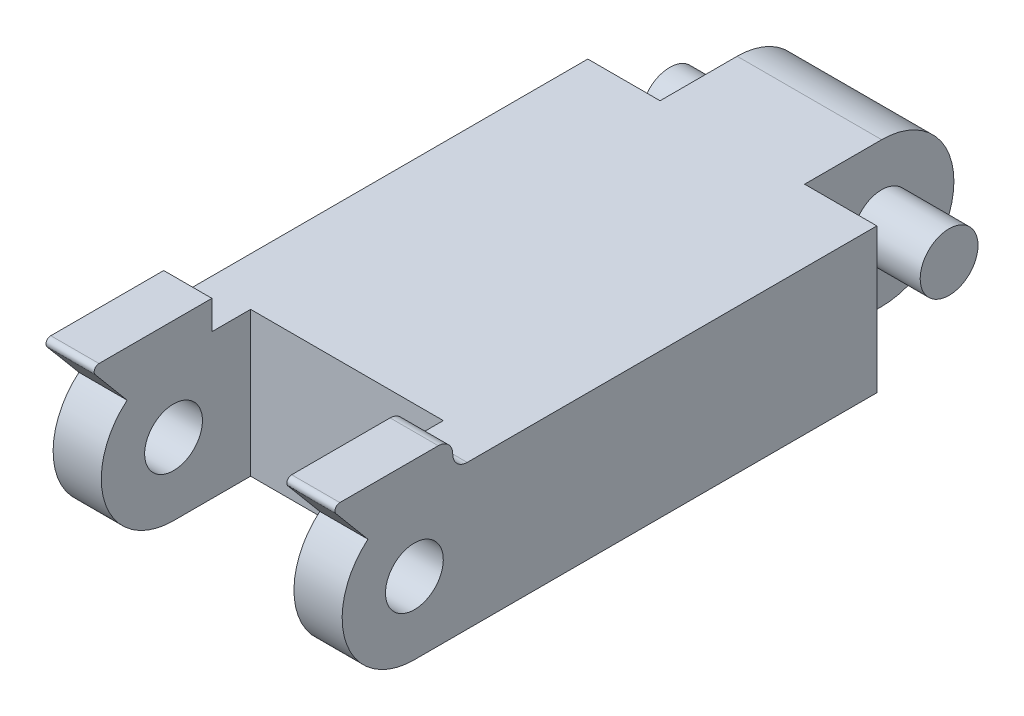
ISO-10303-21;
HEADER;
FILE_DESCRIPTION(('STEP AP214'),'2;1');
FILE_NAME('part.step','',(''),(''),'','','');
FILE_SCHEMA(('AUTOMOTIVE_DESIGN { 1 0 10303 214 1 1 1 1 }'));
ENDSEC;
DATA;
#1=APPLICATION_CONTEXT('core data for automotive mechanical design processes');
#2=APPLICATION_PROTOCOL_DEFINITION('international standard','automotive_design',2000,#1);
#3=PRODUCT_CONTEXT('',#1,'mechanical');
#4=PRODUCT('Part','Part','',(#3));
#5=PRODUCT_RELATED_PRODUCT_CATEGORY('part','',(#4));
#6=PRODUCT_DEFINITION_FORMATION('','',#4);
#7=PRODUCT_DEFINITION_CONTEXT('part definition',#1,'design');
#8=PRODUCT_DEFINITION('design','',#6,#7);
#9=PRODUCT_DEFINITION_SHAPE('','',#8);
#10=(LENGTH_UNIT() NAMED_UNIT(*) SI_UNIT(.MILLI.,.METRE.));
#11=(NAMED_UNIT(*) PLANE_ANGLE_UNIT() SI_UNIT($,.RADIAN.));
#12=(NAMED_UNIT(*) SI_UNIT($,.STERADIAN.) SOLID_ANGLE_UNIT());
#13=UNCERTAINTY_MEASURE_WITH_UNIT(LENGTH_MEASURE(1.E-05),#10,'distance_accuracy_value','');
#14=(GEOMETRIC_REPRESENTATION_CONTEXT(3) GLOBAL_UNCERTAINTY_ASSIGNED_CONTEXT((#13)) GLOBAL_UNIT_ASSIGNED_CONTEXT((#10,
#11,#12)) REPRESENTATION_CONTEXT('',''));
#15=CARTESIAN_POINT('',(0.,0.,0.));
#16=DIRECTION('',(0.,0.,1.));
#17=DIRECTION('',(1.,0.,0.));
#18=AXIS2_PLACEMENT_3D('',#15,#16,#17);
#19=CARTESIAN_POINT('',(-15.,7.5,40.));
#20=DIRECTION('',(0.,-1.,0.));
#21=DIRECTION('',(0.,0.,-1.));
#22=AXIS2_PLACEMENT_3D('',#19,#20,#21);
#23=PLANE('',#22);
#24=DIRECTION('',(0.,0.,-1.));
#25=VECTOR('',#24,1.);
#26=CARTESIAN_POINT('',(-15.,7.5,40.));
#27=LINE('',#26,#25);
#28=CARTESIAN_POINT('',(-15.,7.5,44.0197325904586));
#29=VERTEX_POINT('',#28);
#30=CARTESIAN_POINT('',(-15.,7.5,0.));
#31=VERTEX_POINT('',#30);
#32=EDGE_CURVE('E204',#29,#31,#27,.T.);
#33=ORIENTED_EDGE('',*,*,#32,.F.);
#34=DIRECTION('',(-1.,0.,0.));
#35=VECTOR('',#34,1.);
#36=CARTESIAN_POINT('',(-9.99999999999999,7.5,44.0197325904586));
#37=LINE('',#36,#35);
#38=CARTESIAN_POINT('',(-9.99999999999999,7.5,44.0197325904586));
#39=VERTEX_POINT('',#38);
#40=EDGE_CURVE('E187',#39,#29,#37,.T.);
#41=ORIENTED_EDGE('',*,*,#40,.F.);
#42=DIRECTION('',(0.,0.,1.));
#43=VECTOR('',#42,1.);
#44=CARTESIAN_POINT('',(-10.,7.5,48.));
#45=LINE('',#44,#43);
#46=CARTESIAN_POINT('',(-10.,7.5,40.));
#47=VERTEX_POINT('',#46);
#48=EDGE_CURVE('E201',#47,#39,#45,.T.);
#49=ORIENTED_EDGE('',*,*,#48,.F.);
#50=DIRECTION('',(-1.,0.,0.));
#51=VECTOR('',#50,1.);
#52=CARTESIAN_POINT('',(-15.,7.5,40.));
#53=LINE('',#52,#51);
#54=CARTESIAN_POINT('',(10.,7.5,40.));
#55=VERTEX_POINT('',#54);
#56=EDGE_CURVE('E261',#55,#47,#53,.T.);
#57=ORIENTED_EDGE('',*,*,#56,.F.);
#58=DIRECTION('',(0.,0.,1.));
#59=VECTOR('',#58,1.);
#60=CARTESIAN_POINT('',(10.,7.5,48.));
#61=LINE('',#60,#59);
#62=CARTESIAN_POINT('',(10.,7.5,42.5197325904586));
#63=VERTEX_POINT('',#62);
#64=EDGE_CURVE('E243',#55,#63,#61,.T.);
#65=ORIENTED_EDGE('',*,*,#64,.T.);
#66=DIRECTION('',(1.,0.,0.));
#67=VECTOR('',#66,1.);
#68=CARTESIAN_POINT('',(15.,7.5,42.5197325904586));
#69=LINE('',#68,#67);
#70=CARTESIAN_POINT('',(15.,7.5,42.5197325904586));
#71=VERTEX_POINT('',#70);
#72=EDGE_CURVE('E304',#63,#71,#69,.T.);
#73=ORIENTED_EDGE('',*,*,#72,.T.);
#74=DIRECTION('',(0.,0.,-1.));
#75=VECTOR('',#74,1.);
#76=CARTESIAN_POINT('',(15.,7.5,40.));
#77=LINE('',#76,#75);
#78=CARTESIAN_POINT('',(15.,7.5,0.));
#79=VERTEX_POINT('',#78);
#80=EDGE_CURVE('E293',#71,#79,#77,.T.);
#81=ORIENTED_EDGE('',*,*,#80,.T.);
#82=DIRECTION('',(-1.,0.,0.));
#83=VECTOR('',#82,1.);
#84=CARTESIAN_POINT('',(-15.,7.5,0.));
#85=LINE('',#84,#83);
#86=CARTESIAN_POINT('',(7.5,7.5,0.));
#87=VERTEX_POINT('',#86);
#88=EDGE_CURVE('E273',#79,#87,#85,.T.);
#89=ORIENTED_EDGE('',*,*,#88,.T.);
#90=DIRECTION('',(0.,0.,1.));
#91=VECTOR('',#90,1.);
#92=CARTESIAN_POINT('',(7.5,7.5,0.));
#93=LINE('',#92,#91);
#94=CARTESIAN_POINT('',(7.5,7.5,-8.));
#95=VERTEX_POINT('',#94);
#96=EDGE_CURVE('E424',#95,#87,#93,.T.);
#97=ORIENTED_EDGE('',*,*,#96,.F.);
#98=DIRECTION('',(-1.,0.,0.));
#99=VECTOR('',#98,1.);
#100=CARTESIAN_POINT('',(7.5,7.5,-8.));
#101=LINE('',#100,#99);
#102=CARTESIAN_POINT('',(-7.5,7.5,-8.));
#103=VERTEX_POINT('',#102);
#104=EDGE_CURVE('E428',#95,#103,#101,.T.);
#105=ORIENTED_EDGE('',*,*,#104,.T.);
#106=DIRECTION('',(0.,0.,1.));
#107=VECTOR('',#106,1.);
#108=CARTESIAN_POINT('',(-7.5,7.5,0.));
#109=LINE('',#108,#107);
#110=CARTESIAN_POINT('',(-7.5,7.5,0.));
#111=VERTEX_POINT('',#110);
#112=EDGE_CURVE('E355',#103,#111,#109,.T.);
#113=ORIENTED_EDGE('',*,*,#112,.T.);
#114=EDGE_CURVE('E272',#111,#31,#85,.T.);
#115=ORIENTED_EDGE('',*,*,#114,.T.);
#116=EDGE_LOOP('',(#33,#41,#49,#57,#65,#73,#81,#89,#97,#105,#113,#115));
#117=FACE_BOUND('',#116,.T.);
#118=ADVANCED_FACE('F41',(#117),#23,.F.);
#119=CARTESIAN_POINT('',(10.,0.,48.));
#120=DIRECTION('',(1.,0.,0.));
#121=DIRECTION('',(0.,1.,0.));
#122=AXIS2_PLACEMENT_3D('',#119,#120,#121);
#123=CYLINDRICAL_SURFACE('',#122,7.5);
#124=CARTESIAN_POINT('',(15.,0.,48.));
#125=DIRECTION('',(1.,0.,0.));
#126=DIRECTION('',(0.,-1.,0.));
#127=AXIS2_PLACEMENT_3D('',#124,#125,#126);
#128=CIRCLE('',#127,7.5);
#129=CARTESIAN_POINT('',(15.,5.74533332339233,52.8209070726491));
#130=VERTEX_POINT('',#129);
#131=CARTESIAN_POINT('',(15.,-7.5,48.));
#132=VERTEX_POINT('',#131);
#133=EDGE_CURVE('E238',#130,#132,#128,.T.);
#134=ORIENTED_EDGE('',*,*,#133,.F.);
#135=DIRECTION('',(1.,0.,0.));
#136=VECTOR('',#135,1.);
#137=CARTESIAN_POINT('',(9.99999999999999,5.74533332339233,52.8209070726491));
#138=LINE('',#137,#136);
#139=CARTESIAN_POINT('',(9.99999999999999,5.74533332339233,52.8209070726491));
#140=VERTEX_POINT('',#139);
#141=EDGE_CURVE('E396',#140,#130,#138,.T.);
#142=ORIENTED_EDGE('',*,*,#141,.F.);
#143=CARTESIAN_POINT('',(10.,0.,48.));
#144=DIRECTION('',(1.,0.,0.));
#145=DIRECTION('',(0.,-1.,0.));
#146=AXIS2_PLACEMENT_3D('',#143,#144,#145);
#147=CIRCLE('',#146,7.5);
#148=CARTESIAN_POINT('',(10.,-7.5,48.));
#149=VERTEX_POINT('',#148);
#150=EDGE_CURVE('E247',#140,#149,#147,.T.);
#151=ORIENTED_EDGE('',*,*,#150,.T.);
#152=DIRECTION('',(1.,0.,0.));
#153=VECTOR('',#152,1.);
#154=CARTESIAN_POINT('',(10.,-7.5,48.));
#155=LINE('',#154,#153);
#156=EDGE_CURVE('E254',#149,#132,#155,.T.);
#157=ORIENTED_EDGE('',*,*,#156,.T.);
#158=EDGE_LOOP('',(#134,#142,#151,#157));
#159=FACE_BOUND('',#158,.T.);
#160=ADVANCED_FACE('F473',(#159),#123,.T.);
#161=CARTESIAN_POINT('',(0.,0.,0.));
#162=DIRECTION('',(0.,0.,1.));
#163=DIRECTION('',(1.,0.,0.));
#164=AXIS2_PLACEMENT_3D('',#161,#162,#163);
#165=PLANE('',#164);
#166=DIRECTION('',(0.,-1.,0.));
#167=VECTOR('',#166,1.);
#168=CARTESIAN_POINT('',(7.5,7.5,0.));
#169=LINE('',#168,#167);
#170=CARTESIAN_POINT('',(7.5,-7.5,0.));
#171=VERTEX_POINT('',#170);
#172=EDGE_CURVE('E414',#87,#171,#169,.T.);
#173=ORIENTED_EDGE('',*,*,#172,.F.);
#174=ORIENTED_EDGE('',*,*,#88,.F.);
#175=DIRECTION('',(0.,1.,0.));
#176=VECTOR('',#175,1.);
#177=CARTESIAN_POINT('',(15.,7.5,0.));
#178=LINE('',#177,#176);
#179=CARTESIAN_POINT('',(15.,-7.5,0.));
#180=VERTEX_POINT('',#179);
#181=EDGE_CURVE('E260',#180,#79,#178,.T.);
#182=ORIENTED_EDGE('',*,*,#181,.F.);
#183=DIRECTION('',(1.,0.,0.));
#184=VECTOR('',#183,1.);
#185=CARTESIAN_POINT('',(-15.,-7.5,0.));
#186=LINE('',#185,#184);
#187=EDGE_CURVE('E280',#171,#180,#186,.T.);
#188=ORIENTED_EDGE('',*,*,#187,.F.);
#189=EDGE_LOOP('',(#173,#174,#182,#188));
#190=FACE_BOUND('',#189,.T.);
#191=ADVANCED_FACE('F480',(#190),#165,.F.);
#192=CARTESIAN_POINT('',(0.,0.,40.));
#193=DIRECTION('',(0.,0.,1.));
#194=DIRECTION('',(1.,0.,0.));
#195=AXIS2_PLACEMENT_3D('',#192,#193,#194);
#196=PLANE('',#195);
#197=DIRECTION('',(0.,1.,0.));
#198=VECTOR('',#197,1.);
#199=CARTESIAN_POINT('',(-10.,-7.5,40.));
#200=LINE('',#199,#198);
#201=CARTESIAN_POINT('',(-10.,-7.5,40.));
#202=VERTEX_POINT('',#201);
#203=EDGE_CURVE('E213',#202,#47,#200,.T.);
#204=ORIENTED_EDGE('',*,*,#203,.F.);
#205=DIRECTION('',(1.,0.,0.));
#206=VECTOR('',#205,1.);
#207=CARTESIAN_POINT('',(-15.,-7.5,40.));
#208=LINE('',#207,#206);
#209=CARTESIAN_POINT('',(10.,-7.5,40.));
#210=VERTEX_POINT('',#209);
#211=EDGE_CURVE('E264',#202,#210,#208,.T.);
#212=ORIENTED_EDGE('',*,*,#211,.T.);
#213=DIRECTION('',(0.,1.,0.));
#214=VECTOR('',#213,1.);
#215=CARTESIAN_POINT('',(10.,-7.5,40.));
#216=LINE('',#215,#214);
#217=EDGE_CURVE('E239',#210,#55,#216,.T.);
#218=ORIENTED_EDGE('',*,*,#217,.T.);
#219=ORIENTED_EDGE('',*,*,#56,.T.);
#220=EDGE_LOOP('',(#204,#212,#218,#219));
#221=FACE_BOUND('',#220,.T.);
#222=ADVANCED_FACE('F489',(#221),#196,.T.);
#223=CARTESIAN_POINT('',(15.,7.5,40.));
#224=DIRECTION('',(-1.,0.,0.));
#225=DIRECTION('',(0.,-1.,0.));
#226=AXIS2_PLACEMENT_3D('',#223,#224,#225);
#227=PLANE('',#226);
#228=DIRECTION('',(0.,0.,-1.));
#229=VECTOR('',#228,1.);
#230=CARTESIAN_POINT('',(15.,10.5,0.));
#231=LINE('',#230,#229);
#232=CARTESIAN_POINT('',(15.,10.5,55.7382926671067));
#233=VERTEX_POINT('',#232);
#234=CARTESIAN_POINT('',(15.,10.5,45.5197325904586));
#235=VERTEX_POINT('',#234);
#236=EDGE_CURVE('E330',#233,#235,#231,.T.);
#237=ORIENTED_EDGE('',*,*,#236,.F.);
#238=CARTESIAN_POINT('',(15.,10.,55.7382926671067));
#239=DIRECTION('',(-1.,0.,0.));
#240=DIRECTION('',(0.,-1.,0.));
#241=AXIS2_PLACEMENT_3D('',#238,#239,#240);
#242=CIRCLE('',#241,0.5);
#243=CARTESIAN_POINT('',(15.,9.67860619515673,56.1213148886662));
#244=VERTEX_POINT('',#243);
#245=EDGE_CURVE('E334',#233,#244,#242,.F.);
#246=ORIENTED_EDGE('',*,*,#245,.T.);
#247=DIRECTION('',(0.,0.766044443118977,0.64278760968654));
#248=VECTOR('',#247,1.);
#249=CARTESIAN_POINT('',(15.,-23.635386072293,28.1675562640063));
#250=LINE('',#249,#248);
#251=EDGE_CURVE('E392',#130,#244,#250,.T.);
#252=ORIENTED_EDGE('',*,*,#251,.F.);
#253=ORIENTED_EDGE('',*,*,#133,.T.);
#254=DIRECTION('',(0.,0.,-1.));
#255=VECTOR('',#254,1.);
#256=CARTESIAN_POINT('',(15.,-7.5,40.));
#257=LINE('',#256,#255);
#258=EDGE_CURVE('E268',#132,#180,#257,.T.);
#259=ORIENTED_EDGE('',*,*,#258,.T.);
#260=ORIENTED_EDGE('',*,*,#181,.T.);
#261=ORIENTED_EDGE('',*,*,#80,.F.);
#262=CARTESIAN_POINT('',(15.,9.,42.5197325904586));
#263=DIRECTION('',(-1.,0.,0.));
#264=DIRECTION('',(0.,-1.,0.));
#265=AXIS2_PLACEMENT_3D('',#262,#263,#264);
#266=CIRCLE('',#265,1.5);
#267=CARTESIAN_POINT('',(15.,9.00000000000001,44.0197325904586));
#268=VERTEX_POINT('',#267);
#269=EDGE_CURVE('E319',#71,#268,#266,.T.);
#270=ORIENTED_EDGE('',*,*,#269,.T.);
#271=CARTESIAN_POINT('',(15.,9.00000000000001,45.5197325904586));
#272=DIRECTION('',(-1.,0.,0.));
#273=DIRECTION('',(0.,-1.,0.));
#274=AXIS2_PLACEMENT_3D('',#271,#272,#273);
#275=CIRCLE('',#274,1.5);
#276=EDGE_CURVE('E308',#268,#235,#275,.F.);
#277=ORIENTED_EDGE('',*,*,#276,.T.);
#278=EDGE_LOOP('',(#237,#246,#252,#253,#259,#260,#261,#270,#277));
#279=FACE_BOUND('',#278,.T.);
#280=CARTESIAN_POINT('',(15.,0.,48.));
#281=DIRECTION('',(1.,0.,0.));
#282=DIRECTION('',(0.,1.,0.));
#283=AXIS2_PLACEMENT_3D('',#280,#281,#282);
#284=CIRCLE('',#283,3.);
#285=CARTESIAN_POINT('',(15.,3.00000000000001,48.));
#286=VERTEX_POINT('',#285);
#287=EDGE_CURVE('E221',#286,#286,#284,.T.);
#288=ORIENTED_EDGE('',*,*,#287,.F.);
#289=EDGE_LOOP('',(#288));
#290=FACE_BOUND('',#289,.T.);
#291=ADVANCED_FACE('F486',(#279,#290),#227,.F.);
#292=CARTESIAN_POINT('',(-15.,7.5,40.));
#293=DIRECTION('',(1.,0.,0.));
#294=DIRECTION('',(0.,1.,0.));
#295=AXIS2_PLACEMENT_3D('',#292,#293,#294);
#296=PLANE('',#295);
#297=DIRECTION('',(0.,0.766044443118977,0.64278760968654));
#298=VECTOR('',#297,1.);
#299=CARTESIAN_POINT('',(-15.,-23.635386072293,28.1675562640063));
#300=LINE('',#299,#298);
#301=CARTESIAN_POINT('',(-15.,5.74533332339233,52.8209070726491));
#302=VERTEX_POINT('',#301);
#303=CARTESIAN_POINT('',(-15.,9.67860619515673,56.1213148886662));
#304=VERTEX_POINT('',#303);
#305=EDGE_CURVE('E373',#302,#304,#300,.T.);
#306=ORIENTED_EDGE('',*,*,#305,.T.);
#307=CARTESIAN_POINT('',(-15.,10.,55.7382926671067));
#308=DIRECTION('',(1.,0.,0.));
#309=DIRECTION('',(0.,1.,0.));
#310=AXIS2_PLACEMENT_3D('',#307,#308,#309);
#311=CIRCLE('',#310,0.5);
#312=CARTESIAN_POINT('',(-15.,10.5,55.7382926671067));
#313=VERTEX_POINT('',#312);
#314=EDGE_CURVE('E64',#304,#313,#311,.F.);
#315=ORIENTED_EDGE('',*,*,#314,.T.);
#316=DIRECTION('',(0.,0.,-1.));
#317=VECTOR('',#316,1.);
#318=CARTESIAN_POINT('',(-15.,10.5,0.));
#319=LINE('',#318,#317);
#320=CARTESIAN_POINT('',(-15.,10.5,44.0197325904586));
#321=VERTEX_POINT('',#320);
#322=EDGE_CURVE('E195',#313,#321,#319,.T.);
#323=ORIENTED_EDGE('',*,*,#322,.T.);
#324=DIRECTION('',(0.,-1.,0.));
#325=VECTOR('',#324,1.);
#326=CARTESIAN_POINT('',(-15.,0.,44.0197325904586));
#327=LINE('',#326,#325);
#328=EDGE_CURVE('E376',#321,#29,#327,.T.);
#329=ORIENTED_EDGE('',*,*,#328,.T.);
#330=ORIENTED_EDGE('',*,*,#32,.T.);
#331=DIRECTION('',(0.,-1.,0.));
#332=VECTOR('',#331,1.);
#333=CARTESIAN_POINT('',(-15.,7.5,0.));
#334=LINE('',#333,#332);
#335=CARTESIAN_POINT('',(-15.,-7.5,0.));
#336=VERTEX_POINT('',#335);
#337=EDGE_CURVE('E277',#31,#336,#334,.T.);
#338=ORIENTED_EDGE('',*,*,#337,.T.);
#339=DIRECTION('',(0.,0.,-1.));
#340=VECTOR('',#339,1.);
#341=CARTESIAN_POINT('',(-15.,-7.5,40.));
#342=LINE('',#341,#340);
#343=CARTESIAN_POINT('',(-15.,-7.5,48.));
#344=VERTEX_POINT('',#343);
#345=EDGE_CURVE('E287',#344,#336,#342,.T.);
#346=ORIENTED_EDGE('',*,*,#345,.F.);
#347=CARTESIAN_POINT('',(-15.,0.,48.));
#348=DIRECTION('',(1.,0.,0.));
#349=DIRECTION('',(0.,-1.,0.));
#350=AXIS2_PLACEMENT_3D('',#347,#348,#349);
#351=CIRCLE('',#350,7.5);
#352=EDGE_CURVE('E227',#302,#344,#351,.T.);
#353=ORIENTED_EDGE('',*,*,#352,.F.);
#354=EDGE_LOOP('',(#306,#315,#323,#329,#330,#338,#346,#353));
#355=FACE_BOUND('',#354,.T.);
#356=CARTESIAN_POINT('',(-15.,0.,48.));
#357=DIRECTION('',(1.,0.,0.));
#358=DIRECTION('',(0.,1.,0.));
#359=AXIS2_PLACEMENT_3D('',#356,#357,#358);
#360=CIRCLE('',#359,3.);
#361=CARTESIAN_POINT('',(-15.,3.00000000000001,48.));
#362=VERTEX_POINT('',#361);
#363=EDGE_CURVE('E445',#362,#362,#360,.T.);
#364=ORIENTED_EDGE('',*,*,#363,.T.);
#365=EDGE_LOOP('',(#364));
#366=FACE_BOUND('',#365,.T.);
#367=ADVANCED_FACE('F361',(#355,#366),#296,.F.);
#368=CARTESIAN_POINT('',(-15.,-7.5,40.));
#369=DIRECTION('',(0.,1.,0.));
#370=DIRECTION('',(0.,0.,1.));
#371=AXIS2_PLACEMENT_3D('',#368,#369,#370);
#372=PLANE('',#371);
#373=CARTESIAN_POINT('',(-7.5,-7.5,0.));
#374=VERTEX_POINT('',#373);
#375=EDGE_CURVE('E265',#336,#374,#186,.T.);
#376=ORIENTED_EDGE('',*,*,#375,.T.);
#377=DIRECTION('',(0.,0.,-1.));
#378=VECTOR('',#377,1.);
#379=CARTESIAN_POINT('',(-7.5,-7.5,-8.));
#380=LINE('',#379,#378);
#381=CARTESIAN_POINT('',(-7.5,-7.5,-8.));
#382=VERTEX_POINT('',#381);
#383=EDGE_CURVE('E431',#374,#382,#380,.T.);
#384=ORIENTED_EDGE('',*,*,#383,.T.);
#385=DIRECTION('',(-1.,0.,0.));
#386=VECTOR('',#385,1.);
#387=CARTESIAN_POINT('',(7.5,-7.5,-8.));
#388=LINE('',#387,#386);
#389=CARTESIAN_POINT('',(7.5,-7.5,-8.));
#390=VERTEX_POINT('',#389);
#391=EDGE_CURVE('E441',#390,#382,#388,.T.);
#392=ORIENTED_EDGE('',*,*,#391,.F.);
#393=DIRECTION('',(0.,0.,-1.));
#394=VECTOR('',#393,1.);
#395=CARTESIAN_POINT('',(7.5,-7.5,-8.));
#396=LINE('',#395,#394);
#397=EDGE_CURVE('E418',#171,#390,#396,.T.);
#398=ORIENTED_EDGE('',*,*,#397,.F.);
#399=ORIENTED_EDGE('',*,*,#187,.T.);
#400=ORIENTED_EDGE('',*,*,#258,.F.);
#401=ORIENTED_EDGE('',*,*,#156,.F.);
#402=DIRECTION('',(0.,0.,-1.));
#403=VECTOR('',#402,1.);
#404=CARTESIAN_POINT('',(10.,-7.5,40.));
#405=LINE('',#404,#403);
#406=EDGE_CURVE('E250',#149,#210,#405,.T.);
#407=ORIENTED_EDGE('',*,*,#406,.T.);
#408=ORIENTED_EDGE('',*,*,#211,.F.);
#409=DIRECTION('',(0.,0.,-1.));
#410=VECTOR('',#409,1.);
#411=CARTESIAN_POINT('',(-10.,-7.5,40.));
#412=LINE('',#411,#410);
#413=CARTESIAN_POINT('',(-10.,-7.5,48.));
#414=VERTEX_POINT('',#413);
#415=EDGE_CURVE('E223',#414,#202,#412,.T.);
#416=ORIENTED_EDGE('',*,*,#415,.F.);
#417=DIRECTION('',(-1.,0.,0.));
#418=VECTOR('',#417,1.);
#419=CARTESIAN_POINT('',(-10.,-7.5,48.));
#420=LINE('',#419,#418);
#421=EDGE_CURVE('E215',#414,#344,#420,.T.);
#422=ORIENTED_EDGE('',*,*,#421,.T.);
#423=ORIENTED_EDGE('',*,*,#345,.T.);
#424=EDGE_LOOP('',(#376,#384,#392,#398,#399,#400,#401,#407,#408,#416,#422,#423));
#425=FACE_BOUND('',#424,.T.);
#426=ADVANCED_FACE('F365',(#425),#372,.F.);
#427=ORIENTED_EDGE('',*,*,#114,.F.);
#428=DIRECTION('',(0.,-1.,0.));
#429=VECTOR('',#428,1.);
#430=CARTESIAN_POINT('',(-7.5,7.5,0.));
#431=LINE('',#430,#429);
#432=EDGE_CURVE('E413',#111,#374,#431,.T.);
#433=ORIENTED_EDGE('',*,*,#432,.T.);
#434=ORIENTED_EDGE('',*,*,#375,.F.);
#435=ORIENTED_EDGE('',*,*,#337,.F.);
#436=EDGE_LOOP('',(#427,#433,#434,#435));
#437=FACE_BOUND('',#436,.T.);
#438=ADVANCED_FACE('F359',(#437),#165,.F.);
#439=CARTESIAN_POINT('',(10.,0.,48.));
#440=DIRECTION('',(-1.,0.,0.));
#441=DIRECTION('',(0.,-1.,0.));
#442=AXIS2_PLACEMENT_3D('',#439,#440,#441);
#443=PLANE('',#442);
#444=CARTESIAN_POINT('',(10.,0.,48.));
#445=DIRECTION('',(-1.,0.,0.));
#446=DIRECTION('',(0.,-1.,0.));
#447=AXIS2_PLACEMENT_3D('',#444,#445,#446);
#448=CIRCLE('',#447,3.);
#449=CARTESIAN_POINT('',(10.,-3.,48.));
#450=VERTEX_POINT('',#449);
#451=EDGE_CURVE('E234',#450,#450,#448,.F.);
#452=ORIENTED_EDGE('',*,*,#451,.T.);
#453=EDGE_LOOP('',(#452));
#454=FACE_BOUND('',#453,.T.);
#455=DIRECTION('',(0.,0.766044443118977,0.64278760968654));
#456=VECTOR('',#455,1.);
#457=CARTESIAN_POINT('',(10.,-23.635386072293,28.1675562640063));
#458=LINE('',#457,#456);
#459=CARTESIAN_POINT('',(9.99999999999999,9.67860619515673,56.1213148886662));
#460=VERTEX_POINT('',#459);
#461=EDGE_CURVE('E391',#140,#460,#458,.T.);
#462=ORIENTED_EDGE('',*,*,#461,.T.);
#463=CARTESIAN_POINT('',(10.,10.,55.7382926671067));
#464=DIRECTION('',(-1.,0.,0.));
#465=DIRECTION('',(0.,-1.,0.));
#466=AXIS2_PLACEMENT_3D('',#463,#464,#465);
#467=CIRCLE('',#466,0.5);
#468=CARTESIAN_POINT('',(9.99999999999999,10.5,55.7382926671067));
#469=VERTEX_POINT('',#468);
#470=EDGE_CURVE('E340',#460,#469,#467,.T.);
#471=ORIENTED_EDGE('',*,*,#470,.T.);
#472=DIRECTION('',(0.,0.,-1.));
#473=VECTOR('',#472,1.);
#474=CARTESIAN_POINT('',(9.99999999999999,10.5,0.));
#475=LINE('',#474,#473);
#476=CARTESIAN_POINT('',(9.99999999999999,10.5,45.5197325904586));
#477=VERTEX_POINT('',#476);
#478=EDGE_CURVE('E388',#469,#477,#475,.T.);
#479=ORIENTED_EDGE('',*,*,#478,.T.);
#480=CARTESIAN_POINT('',(10.,9.,45.5197325904586));
#481=DIRECTION('',(-1.,0.,0.));
#482=DIRECTION('',(0.,-1.,0.));
#483=AXIS2_PLACEMENT_3D('',#480,#481,#482);
#484=CIRCLE('',#483,1.5);
#485=CARTESIAN_POINT('',(9.99999999999999,9.,44.0197325904586));
#486=VERTEX_POINT('',#485);
#487=EDGE_CURVE('E316',#477,#486,#484,.T.);
#488=ORIENTED_EDGE('',*,*,#487,.T.);
#489=CARTESIAN_POINT('',(10.,9.,42.5197325904586));
#490=DIRECTION('',(-1.,0.,0.));
#491=DIRECTION('',(0.,-1.,0.));
#492=AXIS2_PLACEMENT_3D('',#489,#490,#491);
#493=CIRCLE('',#492,1.5);
#494=EDGE_CURVE('E322',#486,#63,#493,.F.);
#495=ORIENTED_EDGE('',*,*,#494,.T.);
#496=ORIENTED_EDGE('',*,*,#64,.F.);
#497=ORIENTED_EDGE('',*,*,#217,.F.);
#498=ORIENTED_EDGE('',*,*,#406,.F.);
#499=ORIENTED_EDGE('',*,*,#150,.F.);
#500=EDGE_LOOP('',(#462,#471,#479,#488,#495,#496,#497,#498,#499));
#501=FACE_BOUND('',#500,.T.);
#502=ADVANCED_FACE('F510',(#454,#501),#443,.T.);
#503=CARTESIAN_POINT('',(1.51471862576142,0.,48.));
#504=DIRECTION('',(1.,0.,0.));
#505=DIRECTION('',(0.,1.,0.));
#506=AXIS2_PLACEMENT_3D('',#503,#504,#505);
#507=CYLINDRICAL_SURFACE('',#506,3.);
#508=ORIENTED_EDGE('',*,*,#287,.T.);
#509=EDGE_LOOP('',(#508));
#510=FACE_BOUND('',#509,.T.);
#511=ORIENTED_EDGE('',*,*,#451,.F.);
#512=EDGE_LOOP('',(#511));
#513=FACE_BOUND('',#512,.T.);
#514=ADVANCED_FACE('F555',(#510,#513),#507,.F.);
#515=CARTESIAN_POINT('',(-10.,0.,48.));
#516=DIRECTION('',(-1.,0.,0.));
#517=DIRECTION('',(0.,-1.,0.));
#518=AXIS2_PLACEMENT_3D('',#515,#516,#517);
#519=CYLINDRICAL_SURFACE('',#518,7.5);
#520=CARTESIAN_POINT('',(-10.,0.,48.));
#521=DIRECTION('',(1.,0.,0.));
#522=DIRECTION('',(0.,-1.,0.));
#523=AXIS2_PLACEMENT_3D('',#520,#521,#522);
#524=CIRCLE('',#523,7.5);
#525=CARTESIAN_POINT('',(-9.99999999999999,5.74533332339233,52.8209070726491));
#526=VERTEX_POINT('',#525);
#527=EDGE_CURVE('E216',#526,#414,#524,.T.);
#528=ORIENTED_EDGE('',*,*,#527,.F.);
#529=DIRECTION('',(-1.,0.,0.));
#530=VECTOR('',#529,1.);
#531=CARTESIAN_POINT('',(-9.99999999999999,5.74533332339233,52.8209070726491));
#532=LINE('',#531,#530);
#533=EDGE_CURVE('E206',#526,#302,#532,.T.);
#534=ORIENTED_EDGE('',*,*,#533,.T.);
#535=ORIENTED_EDGE('',*,*,#352,.T.);
#536=ORIENTED_EDGE('',*,*,#421,.F.);
#537=EDGE_LOOP('',(#528,#534,#535,#536));
#538=FACE_BOUND('',#537,.T.);
#539=ADVANCED_FACE('F371',(#538),#519,.T.);
#540=CARTESIAN_POINT('',(-10.,0.,48.));
#541=DIRECTION('',(1.,0.,0.));
#542=DIRECTION('',(0.,-1.,0.));
#543=AXIS2_PLACEMENT_3D('',#540,#541,#542);
#544=PLANE('',#543);
#545=DIRECTION('',(0.,0.,-1.));
#546=VECTOR('',#545,1.);
#547=CARTESIAN_POINT('',(-9.99999999999999,10.5,0.));
#548=LINE('',#547,#546);
#549=CARTESIAN_POINT('',(-9.99999999999999,10.5,55.7382926671067));
#550=VERTEX_POINT('',#549);
#551=CARTESIAN_POINT('',(-9.99999999999999,10.5,44.0197325904586));
#552=VERTEX_POINT('',#551);
#553=EDGE_CURVE('E207',#550,#552,#548,.T.);
#554=ORIENTED_EDGE('',*,*,#553,.F.);
#555=CARTESIAN_POINT('',(-10.,10.,55.7382926671067));
#556=DIRECTION('',(1.,0.,0.));
#557=DIRECTION('',(0.,1.,0.));
#558=AXIS2_PLACEMENT_3D('',#555,#556,#557);
#559=CIRCLE('',#558,0.5);
#560=CARTESIAN_POINT('',(-9.99999999999999,9.67860619515673,56.1213148886662));
#561=VERTEX_POINT('',#560);
#562=EDGE_CURVE('E11',#550,#561,#559,.T.);
#563=ORIENTED_EDGE('',*,*,#562,.T.);
#564=DIRECTION('',(0.,0.766044443118977,0.64278760968654));
#565=VECTOR('',#564,1.);
#566=CARTESIAN_POINT('',(-10.,-23.635386072293,28.1675562640063));
#567=LINE('',#566,#565);
#568=EDGE_CURVE('E194',#526,#561,#567,.T.);
#569=ORIENTED_EDGE('',*,*,#568,.F.);
#570=ORIENTED_EDGE('',*,*,#527,.T.);
#571=ORIENTED_EDGE('',*,*,#415,.T.);
#572=ORIENTED_EDGE('',*,*,#203,.T.);
#573=ORIENTED_EDGE('',*,*,#48,.T.);
#574=DIRECTION('',(0.,-1.,0.));
#575=VECTOR('',#574,1.);
#576=CARTESIAN_POINT('',(-10.,0.,44.0197325904586));
#577=LINE('',#576,#575);
#578=EDGE_CURVE('E183',#552,#39,#577,.T.);
#579=ORIENTED_EDGE('',*,*,#578,.F.);
#580=EDGE_LOOP('',(#554,#563,#569,#570,#571,#572,#573,#579));
#581=FACE_BOUND('',#580,.T.);
#582=CARTESIAN_POINT('',(-10.,0.,48.));
#583=DIRECTION('',(1.,0.,0.));
#584=DIRECTION('',(0.,1.,0.));
#585=AXIS2_PLACEMENT_3D('',#582,#583,#584);
#586=CIRCLE('',#585,3.);
#587=CARTESIAN_POINT('',(-10.,3.00000000000001,48.));
#588=VERTEX_POINT('',#587);
#589=EDGE_CURVE('E229',#588,#588,#586,.T.);
#590=ORIENTED_EDGE('',*,*,#589,.F.);
#591=EDGE_LOOP('',(#590));
#592=FACE_BOUND('',#591,.T.);
#593=ADVANCED_FACE('F209',(#581,#592),#544,.T.);
#594=CARTESIAN_POINT('',(18.4852813742386,0.,48.));
#595=DIRECTION('',(-1.,0.,0.));
#596=DIRECTION('',(0.,-1.,0.));
#597=AXIS2_PLACEMENT_3D('',#594,#595,#596);
#598=CYLINDRICAL_SURFACE('',#597,3.);
#599=ORIENTED_EDGE('',*,*,#363,.F.);
#600=EDGE_LOOP('',(#599));
#601=FACE_BOUND('',#600,.T.);
#602=ORIENTED_EDGE('',*,*,#589,.T.);
#603=EDGE_LOOP('',(#602));
#604=FACE_BOUND('',#603,.T.);
#605=ADVANCED_FACE('F539',(#601,#604),#598,.F.);
#606=CARTESIAN_POINT('',(7.5,0.,-8.));
#607=DIRECTION('',(-1.,0.,0.));
#608=DIRECTION('',(0.,0.,1.));
#609=AXIS2_PLACEMENT_3D('',#606,#607,#608);
#610=CYLINDRICAL_SURFACE('',#609,7.5);
#611=CARTESIAN_POINT('',(-7.5,0.,-8.));
#612=DIRECTION('',(1.,0.,0.));
#613=DIRECTION('',(0.,0.,1.));
#614=AXIS2_PLACEMENT_3D('',#611,#612,#613);
#615=CIRCLE('',#614,7.5);
#616=EDGE_CURVE('E434',#382,#103,#615,.T.);
#617=ORIENTED_EDGE('',*,*,#616,.T.);
#618=ORIENTED_EDGE('',*,*,#104,.F.);
#619=CARTESIAN_POINT('',(7.5,0.,-8.));
#620=DIRECTION('',(1.,0.,0.));
#621=DIRECTION('',(0.,0.,1.));
#622=AXIS2_PLACEMENT_3D('',#619,#620,#621);
#623=CIRCLE('',#622,7.5);
#624=EDGE_CURVE('E421',#390,#95,#623,.T.);
#625=ORIENTED_EDGE('',*,*,#624,.F.);
#626=ORIENTED_EDGE('',*,*,#391,.T.);
#627=EDGE_LOOP('',(#617,#618,#625,#626));
#628=FACE_BOUND('',#627,.T.);
#629=ADVANCED_FACE('F537',(#628),#610,.T.);
#630=CARTESIAN_POINT('',(7.5,0.,-8.));
#631=DIRECTION('',(-1.,0.,0.));
#632=DIRECTION('',(0.,0.,1.));
#633=AXIS2_PLACEMENT_3D('',#630,#631,#632);
#634=PLANE('',#633);
#635=CARTESIAN_POINT('',(7.5,0.,-8.));
#636=DIRECTION('',(-1.,0.,0.));
#637=DIRECTION('',(0.,0.,1.));
#638=AXIS2_PLACEMENT_3D('',#635,#636,#637);
#639=CIRCLE('',#638,3.);
#640=CARTESIAN_POINT('',(7.5,0.,-5.));
#641=VERTEX_POINT('',#640);
#642=EDGE_CURVE('E296',#641,#641,#639,.F.);
#643=ORIENTED_EDGE('',*,*,#642,.F.);
#644=EDGE_LOOP('',(#643));
#645=FACE_BOUND('',#644,.T.);
#646=ORIENTED_EDGE('',*,*,#172,.T.);
#647=ORIENTED_EDGE('',*,*,#397,.T.);
#648=ORIENTED_EDGE('',*,*,#624,.T.);
#649=ORIENTED_EDGE('',*,*,#96,.T.);
#650=EDGE_LOOP('',(#646,#647,#648,#649));
#651=FACE_BOUND('',#650,.T.);
#652=ADVANCED_FACE('F529',(#645,#651),#634,.F.);
#653=CARTESIAN_POINT('',(-7.5,0.,-8.));
#654=DIRECTION('',(-1.,0.,0.));
#655=DIRECTION('',(0.,0.,1.));
#656=AXIS2_PLACEMENT_3D('',#653,#654,#655);
#657=PLANE('',#656);
#658=CARTESIAN_POINT('',(-7.5,0.,-8.));
#659=DIRECTION('',(-1.,0.,0.));
#660=DIRECTION('',(0.,0.,1.));
#661=AXIS2_PLACEMENT_3D('',#658,#659,#660);
#662=CIRCLE('',#661,3.);
#663=CARTESIAN_POINT('',(-7.5,0.,-5.));
#664=VERTEX_POINT('',#663);
#665=EDGE_CURVE('E300',#664,#664,#662,.T.);
#666=ORIENTED_EDGE('',*,*,#665,.F.);
#667=EDGE_LOOP('',(#666));
#668=FACE_BOUND('',#667,.T.);
#669=ORIENTED_EDGE('',*,*,#432,.F.);
#670=ORIENTED_EDGE('',*,*,#112,.F.);
#671=ORIENTED_EDGE('',*,*,#616,.F.);
#672=ORIENTED_EDGE('',*,*,#383,.F.);
#673=EDGE_LOOP('',(#669,#670,#671,#672));
#674=FACE_BOUND('',#673,.T.);
#675=ADVANCED_FACE('F536',(#668,#674),#657,.T.);
#676=CARTESIAN_POINT('',(14.5,0.,-8.));
#677=DIRECTION('',(-1.,0.,0.));
#678=DIRECTION('',(0.,0.,1.));
#679=AXIS2_PLACEMENT_3D('',#676,#677,#678);
#680=CYLINDRICAL_SURFACE('',#679,3.);
#681=CARTESIAN_POINT('',(14.5,0.,-8.));
#682=DIRECTION('',(1.,0.,0.));
#683=DIRECTION('',(0.,0.,-1.));
#684=AXIS2_PLACEMENT_3D('',#681,#682,#683);
#685=CIRCLE('',#684,3.);
#686=CARTESIAN_POINT('',(14.5,0.,-11.));
#687=VERTEX_POINT('',#686);
#688=EDGE_CURVE('E409',#687,#687,#685,.T.);
#689=ORIENTED_EDGE('',*,*,#688,.F.);
#690=EDGE_LOOP('',(#689));
#691=FACE_BOUND('',#690,.T.);
#692=ORIENTED_EDGE('',*,*,#642,.T.);
#693=EDGE_LOOP('',(#692));
#694=FACE_BOUND('',#693,.T.);
#695=ADVANCED_FACE('F707',(#691,#694),#680,.T.);
#696=CARTESIAN_POINT('',(14.5,0.,-8.));
#697=DIRECTION('',(1.,0.,0.));
#698=DIRECTION('',(0.,0.,-1.));
#699=AXIS2_PLACEMENT_3D('',#696,#697,#698);
#700=PLANE('',#699);
#701=ORIENTED_EDGE('',*,*,#688,.T.);
#702=EDGE_LOOP('',(#701));
#703=FACE_BOUND('',#702,.T.);
#704=ADVANCED_FACE('F697',(#703),#700,.T.);
#705=CARTESIAN_POINT('',(-14.5,0.,-8.));
#706=DIRECTION('',(1.,0.,0.));
#707=DIRECTION('',(0.,0.,-1.));
#708=AXIS2_PLACEMENT_3D('',#705,#706,#707);
#709=CYLINDRICAL_SURFACE('',#708,3.);
#710=CARTESIAN_POINT('',(-14.5,0.,-8.));
#711=DIRECTION('',(1.,0.,0.));
#712=DIRECTION('',(0.,0.,-1.));
#713=AXIS2_PLACEMENT_3D('',#710,#711,#712);
#714=CIRCLE('',#713,3.);
#715=CARTESIAN_POINT('',(-14.5,0.,-11.));
#716=VERTEX_POINT('',#715);
#717=EDGE_CURVE('E405',#716,#716,#714,.T.);
#718=ORIENTED_EDGE('',*,*,#717,.T.);
#719=EDGE_LOOP('',(#718));
#720=FACE_BOUND('',#719,.T.);
#721=ORIENTED_EDGE('',*,*,#665,.T.);
#722=EDGE_LOOP('',(#721));
#723=FACE_BOUND('',#722,.T.);
#724=ADVANCED_FACE('F688',(#720,#723),#709,.T.);
#725=CARTESIAN_POINT('',(-14.5,0.,-8.));
#726=DIRECTION('',(-1.,0.,0.));
#727=DIRECTION('',(0.,0.,-1.));
#728=AXIS2_PLACEMENT_3D('',#725,#726,#727);
#729=PLANE('',#728);
#730=ORIENTED_EDGE('',*,*,#717,.F.);
#731=EDGE_LOOP('',(#730));
#732=FACE_BOUND('',#731,.T.);
#733=ADVANCED_FACE('F642',(#732),#729,.T.);
#734=CARTESIAN_POINT('',(10.,-23.635386072293,28.1675562640063));
#735=DIRECTION('',(0.,0.64278760968654,-0.766044443118977));
#736=DIRECTION('',(0.,0.766044443118977,0.64278760968654));
#737=AXIS2_PLACEMENT_3D('',#734,#735,#736);
#738=PLANE('',#737);
#739=ORIENTED_EDGE('',*,*,#251,.T.);
#740=DIRECTION('',(1.,0.,0.));
#741=VECTOR('',#740,1.);
#742=CARTESIAN_POINT('',(9.99999999999999,9.67860619515673,56.1213148886662));
#743=LINE('',#742,#741);
#744=EDGE_CURVE('E337',#244,#460,#743,.F.);
#745=ORIENTED_EDGE('',*,*,#744,.T.);
#746=ORIENTED_EDGE('',*,*,#461,.F.);
#747=ORIENTED_EDGE('',*,*,#141,.T.);
#748=EDGE_LOOP('',(#739,#745,#746,#747));
#749=FACE_BOUND('',#748,.T.);
#750=ADVANCED_FACE('F634',(#749),#738,.F.);
#751=CARTESIAN_POINT('',(9.99999999999999,10.5,0.));
#752=DIRECTION('',(0.,-1.,0.));
#753=DIRECTION('',(1.,0.,0.));
#754=AXIS2_PLACEMENT_3D('',#751,#752,#753);
#755=PLANE('',#754);
#756=ORIENTED_EDGE('',*,*,#478,.F.);
#757=DIRECTION('',(1.,0.,0.));
#758=VECTOR('',#757,1.);
#759=CARTESIAN_POINT('',(9.99999999999999,10.5,55.7382926671067));
#760=LINE('',#759,#758);
#761=EDGE_CURVE('E325',#469,#233,#760,.T.);
#762=ORIENTED_EDGE('',*,*,#761,.T.);
#763=ORIENTED_EDGE('',*,*,#236,.T.);
#764=DIRECTION('',(1.,0.,0.));
#765=VECTOR('',#764,1.);
#766=CARTESIAN_POINT('',(9.99999999999999,10.5,45.5197325904586));
#767=LINE('',#766,#765);
#768=EDGE_CURVE('E312',#235,#477,#767,.F.);
#769=ORIENTED_EDGE('',*,*,#768,.T.);
#770=EDGE_LOOP('',(#756,#762,#763,#769));
#771=FACE_BOUND('',#770,.T.);
#772=ADVANCED_FACE('F498',(#771),#755,.F.);
#773=CARTESIAN_POINT('',(9.99999999999999,9.,45.5197325904586));
#774=DIRECTION('',(1.,0.,0.));
#775=DIRECTION('',(0.,1.,0.));
#776=AXIS2_PLACEMENT_3D('',#773,#774,#775);
#777=CYLINDRICAL_SURFACE('',#776,1.5);
#778=DIRECTION('',(1.,0.,0.));
#779=VECTOR('',#778,1.);
#780=CARTESIAN_POINT('',(9.99999999999999,9.,44.0197325904586));
#781=LINE('',#780,#779);
#782=EDGE_CURVE('E326',#486,#268,#781,.T.);
#783=ORIENTED_EDGE('',*,*,#782,.F.);
#784=ORIENTED_EDGE('',*,*,#487,.F.);
#785=ORIENTED_EDGE('',*,*,#768,.F.);
#786=ORIENTED_EDGE('',*,*,#276,.F.);
#787=EDGE_LOOP('',(#783,#784,#785,#786));
#788=FACE_BOUND('',#787,.T.);
#789=ADVANCED_FACE('F495',(#788),#777,.T.);
#790=CARTESIAN_POINT('',(-15.,9.,42.5197325904586));
#791=DIRECTION('',(-1.,0.,0.));
#792=DIRECTION('',(0.,0.,1.));
#793=AXIS2_PLACEMENT_3D('',#790,#791,#792);
#794=CYLINDRICAL_SURFACE('',#793,1.5);
#795=ORIENTED_EDGE('',*,*,#494,.F.);
#796=ORIENTED_EDGE('',*,*,#782,.T.);
#797=ORIENTED_EDGE('',*,*,#269,.F.);
#798=ORIENTED_EDGE('',*,*,#72,.F.);
#799=EDGE_LOOP('',(#795,#796,#797,#798));
#800=FACE_BOUND('',#799,.T.);
#801=ADVANCED_FACE('F491',(#800),#794,.F.);
#802=CARTESIAN_POINT('',(9.99999999999999,10.,55.7382926671067));
#803=DIRECTION('',(1.,0.,0.));
#804=DIRECTION('',(0.,1.,0.));
#805=AXIS2_PLACEMENT_3D('',#802,#803,#804);
#806=CYLINDRICAL_SURFACE('',#805,0.5);
#807=ORIENTED_EDGE('',*,*,#470,.F.);
#808=ORIENTED_EDGE('',*,*,#744,.F.);
#809=ORIENTED_EDGE('',*,*,#245,.F.);
#810=ORIENTED_EDGE('',*,*,#761,.F.);
#811=EDGE_LOOP('',(#807,#808,#809,#810));
#812=FACE_BOUND('',#811,.T.);
#813=ADVANCED_FACE('F494',(#812),#806,.T.);
#814=CARTESIAN_POINT('',(-10.,0.,44.0197325904586));
#815=DIRECTION('',(0.,0.,-1.));
#816=DIRECTION('',(-1.,0.,0.));
#817=AXIS2_PLACEMENT_3D('',#814,#815,#816);
#818=PLANE('',#817);
#819=ORIENTED_EDGE('',*,*,#328,.F.);
#820=DIRECTION('',(-1.,0.,0.));
#821=VECTOR('',#820,1.);
#822=CARTESIAN_POINT('',(-9.99999999999999,10.5,44.0197325904586));
#823=LINE('',#822,#821);
#824=EDGE_CURVE('E190',#552,#321,#823,.T.);
#825=ORIENTED_EDGE('',*,*,#824,.F.);
#826=ORIENTED_EDGE('',*,*,#578,.T.);
#827=ORIENTED_EDGE('',*,*,#40,.T.);
#828=EDGE_LOOP('',(#819,#825,#826,#827));
#829=FACE_BOUND('',#828,.T.);
#830=ADVANCED_FACE('F186',(#829),#818,.T.);
#831=CARTESIAN_POINT('',(-9.99999999999999,10.5,0.));
#832=DIRECTION('',(0.,1.,0.));
#833=DIRECTION('',(-1.,0.,0.));
#834=AXIS2_PLACEMENT_3D('',#831,#832,#833);
#835=PLANE('',#834);
#836=ORIENTED_EDGE('',*,*,#322,.F.);
#837=DIRECTION('',(-1.,0.,0.));
#838=VECTOR('',#837,1.);
#839=CARTESIAN_POINT('',(-9.99999999999999,10.5,55.7382926671067));
#840=LINE('',#839,#838);
#841=EDGE_CURVE('E50',#313,#550,#840,.F.);
#842=ORIENTED_EDGE('',*,*,#841,.T.);
#843=ORIENTED_EDGE('',*,*,#553,.T.);
#844=ORIENTED_EDGE('',*,*,#824,.T.);
#845=EDGE_LOOP('',(#836,#842,#843,#844));
#846=FACE_BOUND('',#845,.T.);
#847=ADVANCED_FACE('F461',(#846),#835,.T.);
#848=CARTESIAN_POINT('',(-10.,-23.635386072293,28.1675562640063));
#849=DIRECTION('',(0.,-0.64278760968654,0.766044443118977));
#850=DIRECTION('',(0.,-0.766044443118977,-0.64278760968654));
#851=AXIS2_PLACEMENT_3D('',#848,#849,#850);
#852=PLANE('',#851);
#853=ORIENTED_EDGE('',*,*,#568,.T.);
#854=DIRECTION('',(-1.,0.,0.));
#855=VECTOR('',#854,1.);
#856=CARTESIAN_POINT('',(-9.99999999999999,9.67860619515673,56.1213148886662));
#857=LINE('',#856,#855);
#858=EDGE_CURVE('E343',#561,#304,#857,.T.);
#859=ORIENTED_EDGE('',*,*,#858,.T.);
#860=ORIENTED_EDGE('',*,*,#305,.F.);
#861=ORIENTED_EDGE('',*,*,#533,.F.);
#862=EDGE_LOOP('',(#853,#859,#860,#861));
#863=FACE_BOUND('',#862,.T.);
#864=ADVANCED_FACE('F463',(#863),#852,.T.);
#865=CARTESIAN_POINT('',(-9.99999999999999,10.,55.7382926671067));
#866=DIRECTION('',(-1.,0.,0.));
#867=DIRECTION('',(0.,-1.,0.));
#868=AXIS2_PLACEMENT_3D('',#865,#866,#867);
#869=CYLINDRICAL_SURFACE('',#868,0.5);
#870=ORIENTED_EDGE('',*,*,#562,.F.);
#871=ORIENTED_EDGE('',*,*,#841,.F.);
#872=ORIENTED_EDGE('',*,*,#314,.F.);
#873=ORIENTED_EDGE('',*,*,#858,.F.);
#874=EDGE_LOOP('',(#870,#871,#872,#873));
#875=FACE_BOUND('',#874,.T.);
#876=ADVANCED_FACE('F43',(#875),#869,.T.);
#877=CLOSED_SHELL('',(#118,#160,#191,#222,#291,#367,#426,#438,#502,#514,#539,#593,#605,#629,
#652,#675,#695,#704,#724,#733,#750,#772,#789,#801,#813,#830,#847,#864,#876));
#878=MANIFOLD_SOLID_BREP('B2',#877);
#879=ADVANCED_BREP_SHAPE_REPRESENTATION('',(#18,#878),#14);
#880=SHAPE_DEFINITION_REPRESENTATION(#9,#879);
ENDSEC;
END-ISO-10303-21;
